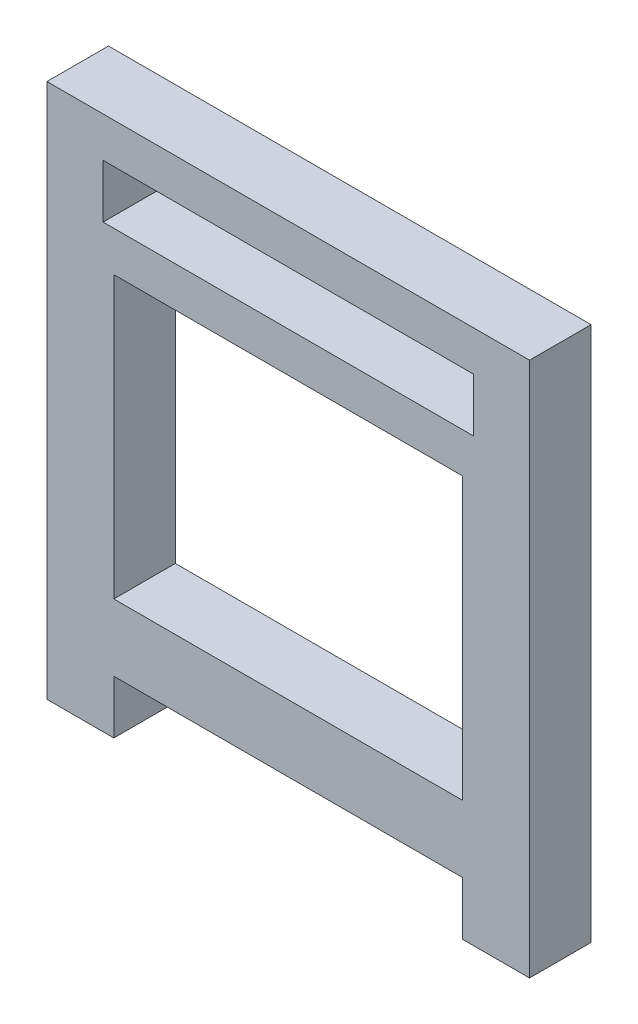
ISO-10303-21;
HEADER;
FILE_DESCRIPTION(('STEP AP214'),'2;1');
FILE_NAME('part.step','',(''),(''),'','','');
FILE_SCHEMA(('AUTOMOTIVE_DESIGN { 1 0 10303 214 1 1 1 1 }'));
ENDSEC;
DATA;
#1=APPLICATION_CONTEXT('core data for automotive mechanical design processes');
#2=APPLICATION_PROTOCOL_DEFINITION('international standard','automotive_design',2000,#1);
#3=PRODUCT_CONTEXT('',#1,'mechanical');
#4=PRODUCT('Part','Part','',(#3));
#5=PRODUCT_RELATED_PRODUCT_CATEGORY('part','',(#4));
#6=PRODUCT_DEFINITION_FORMATION('','',#4);
#7=PRODUCT_DEFINITION_CONTEXT('part definition',#1,'design');
#8=PRODUCT_DEFINITION('design','',#6,#7);
#9=PRODUCT_DEFINITION_SHAPE('','',#8);
#10=(LENGTH_UNIT() NAMED_UNIT(*) SI_UNIT(.MILLI.,.METRE.));
#11=(NAMED_UNIT(*) PLANE_ANGLE_UNIT() SI_UNIT($,.RADIAN.));
#12=(NAMED_UNIT(*) SI_UNIT($,.STERADIAN.) SOLID_ANGLE_UNIT());
#13=UNCERTAINTY_MEASURE_WITH_UNIT(LENGTH_MEASURE(1.E-05),#10,'distance_accuracy_value','');
#14=(GEOMETRIC_REPRESENTATION_CONTEXT(3) GLOBAL_UNCERTAINTY_ASSIGNED_CONTEXT((#13)) GLOBAL_UNIT_ASSIGNED_CONTEXT((#10,
#11,#12)) REPRESENTATION_CONTEXT('',''));
#15=CARTESIAN_POINT('',(0.,0.,0.));
#16=DIRECTION('',(0.,0.,1.));
#17=DIRECTION('',(1.,0.,0.));
#18=AXIS2_PLACEMENT_3D('',#15,#16,#17);
#19=CARTESIAN_POINT('',(0.,0.,2.3));
#20=DIRECTION('',(0.,0.,-1.));
#21=DIRECTION('',(-1.,0.,0.));
#22=AXIS2_PLACEMENT_3D('',#19,#20,#21);
#23=PLANE('',#22);
#24=DIRECTION('',(0.,1.,0.));
#25=VECTOR('',#24,1.);
#26=CARTESIAN_POINT('',(15.54,2.5,2.3));
#27=LINE('',#26,#25);
#28=CARTESIAN_POINT('',(15.54,2.5,2.3));
#29=VERTEX_POINT('',#28);
#30=CARTESIAN_POINT('',(15.54,13.,2.3));
#31=VERTEX_POINT('',#30);
#32=EDGE_CURVE('E188',#29,#31,#27,.T.);
#33=ORIENTED_EDGE('',*,*,#32,.F.);
#34=DIRECTION('',(1.,0.,0.));
#35=VECTOR('',#34,1.);
#36=CARTESIAN_POINT('',(2.5,2.5,2.3));
#37=LINE('',#36,#35);
#38=CARTESIAN_POINT('',(2.5,2.5,2.3));
#39=VERTEX_POINT('',#38);
#40=EDGE_CURVE('E196',#39,#29,#37,.T.);
#41=ORIENTED_EDGE('',*,*,#40,.F.);
#42=DIRECTION('',(0.,-1.,0.));
#43=VECTOR('',#42,1.);
#44=CARTESIAN_POINT('',(2.5,2.5,2.3));
#45=LINE('',#44,#43);
#46=CARTESIAN_POINT('',(2.5,13.,2.3));
#47=VERTEX_POINT('',#46);
#48=EDGE_CURVE('E193',#47,#39,#45,.T.);
#49=ORIENTED_EDGE('',*,*,#48,.F.);
#50=DIRECTION('',(-1.,0.,0.));
#51=VECTOR('',#50,1.);
#52=CARTESIAN_POINT('',(2.5,13.,2.3));
#53=LINE('',#52,#51);
#54=EDGE_CURVE('E190',#31,#47,#53,.T.);
#55=ORIENTED_EDGE('',*,*,#54,.F.);
#56=EDGE_LOOP('',(#33,#41,#49,#55));
#57=FACE_BOUND('',#56,.T.);
#58=DIRECTION('',(0.,-1.,0.));
#59=VECTOR('',#58,1.);
#60=CARTESIAN_POINT('',(0.,0.,2.3));
#61=LINE('',#60,#59);
#62=CARTESIAN_POINT('',(0.,18.,2.3));
#63=VERTEX_POINT('',#62);
#64=CARTESIAN_POINT('',(0.,-2.,2.3));
#65=VERTEX_POINT('',#64);
#66=EDGE_CURVE('E219',#63,#65,#61,.T.);
#67=ORIENTED_EDGE('',*,*,#66,.T.);
#68=DIRECTION('',(1.,0.,0.));
#69=VECTOR('',#68,1.);
#70=CARTESIAN_POINT('',(0.,-2.,2.3));
#71=LINE('',#70,#69);
#72=CARTESIAN_POINT('',(2.5,-2.,2.3));
#73=VERTEX_POINT('',#72);
#74=EDGE_CURVE('E221',#65,#73,#71,.T.);
#75=ORIENTED_EDGE('',*,*,#74,.T.);
#76=DIRECTION('',(0.,1.,0.));
#77=VECTOR('',#76,1.);
#78=CARTESIAN_POINT('',(2.5,-2.,2.3));
#79=LINE('',#78,#77);
#80=CARTESIAN_POINT('',(2.5,0.,2.3));
#81=VERTEX_POINT('',#80);
#82=EDGE_CURVE('E224',#73,#81,#79,.T.);
#83=ORIENTED_EDGE('',*,*,#82,.T.);
#84=DIRECTION('',(1.,0.,0.));
#85=VECTOR('',#84,1.);
#86=CARTESIAN_POINT('',(2.5,0.,2.3));
#87=LINE('',#86,#85);
#88=CARTESIAN_POINT('',(15.54,0.,2.3));
#89=VERTEX_POINT('',#88);
#90=EDGE_CURVE('E226',#81,#89,#87,.T.);
#91=ORIENTED_EDGE('',*,*,#90,.T.);
#92=DIRECTION('',(0.,-1.,0.));
#93=VECTOR('',#92,1.);
#94=CARTESIAN_POINT('',(15.54,-2.,2.3));
#95=LINE('',#94,#93);
#96=CARTESIAN_POINT('',(15.54,-2.,2.3));
#97=VERTEX_POINT('',#96);
#98=EDGE_CURVE('E228',#89,#97,#95,.T.);
#99=ORIENTED_EDGE('',*,*,#98,.T.);
#100=DIRECTION('',(1.,0.,0.));
#101=VECTOR('',#100,1.);
#102=CARTESIAN_POINT('',(18.04,-2.,2.3));
#103=LINE('',#102,#101);
#104=CARTESIAN_POINT('',(18.04,-2.,2.3));
#105=VERTEX_POINT('',#104);
#106=EDGE_CURVE('E230',#97,#105,#103,.T.);
#107=ORIENTED_EDGE('',*,*,#106,.T.);
#108=DIRECTION('',(0.,1.,0.));
#109=VECTOR('',#108,1.);
#110=CARTESIAN_POINT('',(18.04,0.,2.3));
#111=LINE('',#110,#109);
#112=CARTESIAN_POINT('',(18.04,18.,2.3));
#113=VERTEX_POINT('',#112);
#114=EDGE_CURVE('E232',#105,#113,#111,.T.);
#115=ORIENTED_EDGE('',*,*,#114,.T.);
#116=DIRECTION('',(-1.,0.,0.));
#117=VECTOR('',#116,1.);
#118=CARTESIAN_POINT('',(0.,18.,2.3));
#119=LINE('',#118,#117);
#120=EDGE_CURVE('E234',#113,#63,#119,.T.);
#121=ORIENTED_EDGE('',*,*,#120,.T.);
#122=EDGE_LOOP('',(#67,#75,#83,#91,#99,#107,#115,#121));
#123=FACE_BOUND('',#122,.T.);
#124=DIRECTION('',(0.,-1.,0.));
#125=VECTOR('',#124,1.);
#126=CARTESIAN_POINT('',(2.1,14.5,2.3));
#127=LINE('',#126,#125);
#128=CARTESIAN_POINT('',(2.1,16.5,2.3));
#129=VERTEX_POINT('',#128);
#130=CARTESIAN_POINT('',(2.1,14.5,2.3));
#131=VERTEX_POINT('',#130);
#132=EDGE_CURVE('E152',#129,#131,#127,.T.);
#133=ORIENTED_EDGE('',*,*,#132,.F.);
#134=DIRECTION('',(-1.,0.,0.));
#135=VECTOR('',#134,1.);
#136=CARTESIAN_POINT('',(2.1,16.5,2.3));
#137=LINE('',#136,#135);
#138=CARTESIAN_POINT('',(15.94,16.5,2.3));
#139=VERTEX_POINT('',#138);
#140=EDGE_CURVE('E174',#139,#129,#137,.T.);
#141=ORIENTED_EDGE('',*,*,#140,.F.);
#142=DIRECTION('',(0.,1.,0.));
#143=VECTOR('',#142,1.);
#144=CARTESIAN_POINT('',(15.94,14.5,2.3));
#145=LINE('',#144,#143);
#146=CARTESIAN_POINT('',(15.94,14.5,2.3));
#147=VERTEX_POINT('',#146);
#148=EDGE_CURVE('E172',#147,#139,#145,.T.);
#149=ORIENTED_EDGE('',*,*,#148,.F.);
#150=DIRECTION('',(1.,0.,0.));
#151=VECTOR('',#150,1.);
#152=CARTESIAN_POINT('',(2.1,14.5,2.3));
#153=LINE('',#152,#151);
#154=EDGE_CURVE('E160',#131,#147,#153,.T.);
#155=ORIENTED_EDGE('',*,*,#154,.F.);
#156=EDGE_LOOP('',(#133,#141,#149,#155));
#157=FACE_BOUND('',#156,.T.);
#158=ADVANCED_FACE('F39',(#57,#123,#157),#23,.F.);
#159=CARTESIAN_POINT('',(0.,0.,0.));
#160=DIRECTION('',(0.,0.,-1.));
#161=DIRECTION('',(-1.,0.,0.));
#162=AXIS2_PLACEMENT_3D('',#159,#160,#161);
#163=PLANE('',#162);
#164=DIRECTION('',(0.,-1.,0.));
#165=VECTOR('',#164,1.);
#166=CARTESIAN_POINT('',(0.,0.,0.));
#167=LINE('',#166,#165);
#168=CARTESIAN_POINT('',(0.,18.,0.));
#169=VERTEX_POINT('',#168);
#170=CARTESIAN_POINT('',(0.,-2.,0.));
#171=VERTEX_POINT('',#170);
#172=EDGE_CURVE('E218',#169,#171,#167,.T.);
#173=ORIENTED_EDGE('',*,*,#172,.F.);
#174=DIRECTION('',(-1.,0.,0.));
#175=VECTOR('',#174,1.);
#176=CARTESIAN_POINT('',(0.,18.,0.));
#177=LINE('',#176,#175);
#178=CARTESIAN_POINT('',(18.04,18.,0.));
#179=VERTEX_POINT('',#178);
#180=EDGE_CURVE('E222',#179,#169,#177,.T.);
#181=ORIENTED_EDGE('',*,*,#180,.F.);
#182=DIRECTION('',(0.,1.,0.));
#183=VECTOR('',#182,1.);
#184=CARTESIAN_POINT('',(18.04,0.,0.));
#185=LINE('',#184,#183);
#186=CARTESIAN_POINT('',(18.04,-2.,0.));
#187=VERTEX_POINT('',#186);
#188=EDGE_CURVE('E249',#187,#179,#185,.T.);
#189=ORIENTED_EDGE('',*,*,#188,.F.);
#190=DIRECTION('',(1.,0.,0.));
#191=VECTOR('',#190,1.);
#192=CARTESIAN_POINT('',(18.04,-2.,0.));
#193=LINE('',#192,#191);
#194=CARTESIAN_POINT('',(15.54,-2.,0.));
#195=VERTEX_POINT('',#194);
#196=EDGE_CURVE('E246',#195,#187,#193,.T.);
#197=ORIENTED_EDGE('',*,*,#196,.F.);
#198=DIRECTION('',(0.,-1.,0.));
#199=VECTOR('',#198,1.);
#200=CARTESIAN_POINT('',(15.54,-2.,0.));
#201=LINE('',#200,#199);
#202=CARTESIAN_POINT('',(15.54,0.,0.));
#203=VERTEX_POINT('',#202);
#204=EDGE_CURVE('E244',#203,#195,#201,.T.);
#205=ORIENTED_EDGE('',*,*,#204,.F.);
#206=DIRECTION('',(1.,0.,0.));
#207=VECTOR('',#206,1.);
#208=CARTESIAN_POINT('',(2.5,0.,0.));
#209=LINE('',#208,#207);
#210=CARTESIAN_POINT('',(2.5,0.,0.));
#211=VERTEX_POINT('',#210);
#212=EDGE_CURVE('E242',#211,#203,#209,.T.);
#213=ORIENTED_EDGE('',*,*,#212,.F.);
#214=DIRECTION('',(0.,1.,0.));
#215=VECTOR('',#214,1.);
#216=CARTESIAN_POINT('',(2.5,-2.,0.));
#217=LINE('',#216,#215);
#218=CARTESIAN_POINT('',(2.5,-2.,0.));
#219=VERTEX_POINT('',#218);
#220=EDGE_CURVE('E240',#219,#211,#217,.T.);
#221=ORIENTED_EDGE('',*,*,#220,.F.);
#222=DIRECTION('',(1.,0.,0.));
#223=VECTOR('',#222,1.);
#224=CARTESIAN_POINT('',(0.,-2.,0.));
#225=LINE('',#224,#223);
#226=EDGE_CURVE('E238',#171,#219,#225,.T.);
#227=ORIENTED_EDGE('',*,*,#226,.F.);
#228=EDGE_LOOP('',(#173,#181,#189,#197,#205,#213,#221,#227));
#229=FACE_BOUND('',#228,.T.);
#230=DIRECTION('',(1.,0.,0.));
#231=VECTOR('',#230,1.);
#232=CARTESIAN_POINT('',(2.5,2.5,0.));
#233=LINE('',#232,#231);
#234=CARTESIAN_POINT('',(2.5,2.5,0.));
#235=VERTEX_POINT('',#234);
#236=CARTESIAN_POINT('',(15.54,2.5,0.));
#237=VERTEX_POINT('',#236);
#238=EDGE_CURVE('E191',#235,#237,#233,.T.);
#239=ORIENTED_EDGE('',*,*,#238,.T.);
#240=DIRECTION('',(0.,1.,0.));
#241=VECTOR('',#240,1.);
#242=CARTESIAN_POINT('',(15.54,2.5,0.));
#243=LINE('',#242,#241);
#244=CARTESIAN_POINT('',(15.54,13.,0.));
#245=VERTEX_POINT('',#244);
#246=EDGE_CURVE('E168',#237,#245,#243,.T.);
#247=ORIENTED_EDGE('',*,*,#246,.T.);
#248=DIRECTION('',(-1.,0.,0.));
#249=VECTOR('',#248,1.);
#250=CARTESIAN_POINT('',(2.5,13.,0.));
#251=LINE('',#250,#249);
#252=CARTESIAN_POINT('',(2.5,13.,0.));
#253=VERTEX_POINT('',#252);
#254=EDGE_CURVE('E201',#245,#253,#251,.T.);
#255=ORIENTED_EDGE('',*,*,#254,.T.);
#256=DIRECTION('',(0.,-1.,0.));
#257=VECTOR('',#256,1.);
#258=CARTESIAN_POINT('',(2.5,2.5,0.));
#259=LINE('',#258,#257);
#260=EDGE_CURVE('E204',#253,#235,#259,.T.);
#261=ORIENTED_EDGE('',*,*,#260,.T.);
#262=EDGE_LOOP('',(#239,#247,#255,#261));
#263=FACE_BOUND('',#262,.T.);
#264=DIRECTION('',(-1.,0.,0.));
#265=VECTOR('',#264,1.);
#266=CARTESIAN_POINT('',(2.1,16.5,0.));
#267=LINE('',#266,#265);
#268=CARTESIAN_POINT('',(15.94,16.5,0.));
#269=VERTEX_POINT('',#268);
#270=CARTESIAN_POINT('',(2.1,16.5,0.));
#271=VERTEX_POINT('',#270);
#272=EDGE_CURVE('E161',#269,#271,#267,.T.);
#273=ORIENTED_EDGE('',*,*,#272,.T.);
#274=DIRECTION('',(0.,-1.,0.));
#275=VECTOR('',#274,1.);
#276=CARTESIAN_POINT('',(2.1,14.5,0.));
#277=LINE('',#276,#275);
#278=CARTESIAN_POINT('',(2.1,14.5,0.));
#279=VERTEX_POINT('',#278);
#280=EDGE_CURVE('E62',#271,#279,#277,.T.);
#281=ORIENTED_EDGE('',*,*,#280,.T.);
#282=DIRECTION('',(1.,0.,0.));
#283=VECTOR('',#282,1.);
#284=CARTESIAN_POINT('',(2.1,14.5,0.));
#285=LINE('',#284,#283);
#286=CARTESIAN_POINT('',(15.94,14.5,0.));
#287=VERTEX_POINT('',#286);
#288=EDGE_CURVE('E167',#279,#287,#285,.T.);
#289=ORIENTED_EDGE('',*,*,#288,.T.);
#290=DIRECTION('',(0.,1.,0.));
#291=VECTOR('',#290,1.);
#292=CARTESIAN_POINT('',(15.94,14.5,0.));
#293=LINE('',#292,#291);
#294=EDGE_CURVE('E180',#287,#269,#293,.T.);
#295=ORIENTED_EDGE('',*,*,#294,.T.);
#296=EDGE_LOOP('',(#273,#281,#289,#295));
#297=FACE_BOUND('',#296,.T.);
#298=ADVANCED_FACE('F281',(#229,#263,#297),#163,.T.);
#299=CARTESIAN_POINT('',(0.,0.,2.3));
#300=DIRECTION('',(1.,0.,0.));
#301=DIRECTION('',(0.,1.,0.));
#302=AXIS2_PLACEMENT_3D('',#299,#300,#301);
#303=PLANE('',#302);
#304=ORIENTED_EDGE('',*,*,#172,.T.);
#305=DIRECTION('',(0.,0.,-1.));
#306=VECTOR('',#305,1.);
#307=CARTESIAN_POINT('',(0.,-2.,2.3));
#308=LINE('',#307,#306);
#309=EDGE_CURVE('E11',#65,#171,#308,.T.);
#310=ORIENTED_EDGE('',*,*,#309,.F.);
#311=ORIENTED_EDGE('',*,*,#66,.F.);
#312=DIRECTION('',(0.,0.,-1.));
#313=VECTOR('',#312,1.);
#314=CARTESIAN_POINT('',(0.,18.,2.3));
#315=LINE('',#314,#313);
#316=EDGE_CURVE('E236',#63,#169,#315,.T.);
#317=ORIENTED_EDGE('',*,*,#316,.T.);
#318=EDGE_LOOP('',(#304,#310,#311,#317));
#319=FACE_BOUND('',#318,.T.);
#320=ADVANCED_FACE('F41',(#319),#303,.F.);
#321=CARTESIAN_POINT('',(0.,-2.,2.3));
#322=DIRECTION('',(0.,1.,0.));
#323=DIRECTION('',(0.,0.,1.));
#324=AXIS2_PLACEMENT_3D('',#321,#322,#323);
#325=PLANE('',#324);
#326=ORIENTED_EDGE('',*,*,#226,.T.);
#327=DIRECTION('',(0.,0.,-1.));
#328=VECTOR('',#327,1.);
#329=CARTESIAN_POINT('',(2.5,-2.,2.3));
#330=LINE('',#329,#328);
#331=EDGE_CURVE('E47',#73,#219,#330,.T.);
#332=ORIENTED_EDGE('',*,*,#331,.F.);
#333=ORIENTED_EDGE('',*,*,#74,.F.);
#334=ORIENTED_EDGE('',*,*,#309,.T.);
#335=EDGE_LOOP('',(#326,#332,#333,#334));
#336=FACE_BOUND('',#335,.T.);
#337=ADVANCED_FACE('F298',(#336),#325,.F.);
#338=CARTESIAN_POINT('',(2.5,-2.,2.3));
#339=DIRECTION('',(-1.,0.,0.));
#340=DIRECTION('',(0.,0.,1.));
#341=AXIS2_PLACEMENT_3D('',#338,#339,#340);
#342=PLANE('',#341);
#343=ORIENTED_EDGE('',*,*,#220,.T.);
#344=DIRECTION('',(0.,0.,-1.));
#345=VECTOR('',#344,1.);
#346=CARTESIAN_POINT('',(2.5,0.,2.3));
#347=LINE('',#346,#345);
#348=EDGE_CURVE('E267',#81,#211,#347,.T.);
#349=ORIENTED_EDGE('',*,*,#348,.F.);
#350=ORIENTED_EDGE('',*,*,#82,.F.);
#351=ORIENTED_EDGE('',*,*,#331,.T.);
#352=EDGE_LOOP('',(#343,#349,#350,#351));
#353=FACE_BOUND('',#352,.T.);
#354=ADVANCED_FACE('F274',(#353),#342,.F.);
#355=CARTESIAN_POINT('',(2.5,0.,2.3));
#356=DIRECTION('',(0.,1.,0.));
#357=DIRECTION('',(0.,0.,1.));
#358=AXIS2_PLACEMENT_3D('',#355,#356,#357);
#359=PLANE('',#358);
#360=ORIENTED_EDGE('',*,*,#212,.T.);
#361=DIRECTION('',(0.,0.,-1.));
#362=VECTOR('',#361,1.);
#363=CARTESIAN_POINT('',(15.54,0.,2.3));
#364=LINE('',#363,#362);
#365=EDGE_CURVE('E264',#89,#203,#364,.T.);
#366=ORIENTED_EDGE('',*,*,#365,.F.);
#367=ORIENTED_EDGE('',*,*,#90,.F.);
#368=ORIENTED_EDGE('',*,*,#348,.T.);
#369=EDGE_LOOP('',(#360,#366,#367,#368));
#370=FACE_BOUND('',#369,.T.);
#371=ADVANCED_FACE('F287',(#370),#359,.F.);
#372=CARTESIAN_POINT('',(15.54,-2.,2.3));
#373=DIRECTION('',(1.,0.,0.));
#374=DIRECTION('',(0.,0.,-1.));
#375=AXIS2_PLACEMENT_3D('',#372,#373,#374);
#376=PLANE('',#375);
#377=ORIENTED_EDGE('',*,*,#204,.T.);
#378=DIRECTION('',(0.,0.,-1.));
#379=VECTOR('',#378,1.);
#380=CARTESIAN_POINT('',(15.54,-2.,2.3));
#381=LINE('',#380,#379);
#382=EDGE_CURVE('E261',#97,#195,#381,.T.);
#383=ORIENTED_EDGE('',*,*,#382,.F.);
#384=ORIENTED_EDGE('',*,*,#98,.F.);
#385=ORIENTED_EDGE('',*,*,#365,.T.);
#386=EDGE_LOOP('',(#377,#383,#384,#385));
#387=FACE_BOUND('',#386,.T.);
#388=ADVANCED_FACE('F291',(#387),#376,.F.);
#389=CARTESIAN_POINT('',(18.04,-2.,2.3));
#390=DIRECTION('',(0.,1.,0.));
#391=DIRECTION('',(-1.,0.,0.));
#392=AXIS2_PLACEMENT_3D('',#389,#390,#391);
#393=PLANE('',#392);
#394=ORIENTED_EDGE('',*,*,#196,.T.);
#395=DIRECTION('',(0.,0.,-1.));
#396=VECTOR('',#395,1.);
#397=CARTESIAN_POINT('',(18.04,-2.,2.3));
#398=LINE('',#397,#396);
#399=EDGE_CURVE('E258',#105,#187,#398,.T.);
#400=ORIENTED_EDGE('',*,*,#399,.F.);
#401=ORIENTED_EDGE('',*,*,#106,.F.);
#402=ORIENTED_EDGE('',*,*,#382,.T.);
#403=EDGE_LOOP('',(#394,#400,#401,#402));
#404=FACE_BOUND('',#403,.T.);
#405=ADVANCED_FACE('F310',(#404),#393,.F.);
#406=CARTESIAN_POINT('',(18.04,0.,2.3));
#407=DIRECTION('',(-1.,0.,0.));
#408=DIRECTION('',(0.,0.,1.));
#409=AXIS2_PLACEMENT_3D('',#406,#407,#408);
#410=PLANE('',#409);
#411=ORIENTED_EDGE('',*,*,#188,.T.);
#412=DIRECTION('',(0.,0.,-1.));
#413=VECTOR('',#412,1.);
#414=CARTESIAN_POINT('',(18.04,18.,2.3));
#415=LINE('',#414,#413);
#416=EDGE_CURVE('E255',#113,#179,#415,.T.);
#417=ORIENTED_EDGE('',*,*,#416,.F.);
#418=ORIENTED_EDGE('',*,*,#114,.F.);
#419=ORIENTED_EDGE('',*,*,#399,.T.);
#420=EDGE_LOOP('',(#411,#417,#418,#419));
#421=FACE_BOUND('',#420,.T.);
#422=ADVANCED_FACE('F308',(#421),#410,.F.);
#423=CARTESIAN_POINT('',(0.,18.,2.3));
#424=DIRECTION('',(0.,-1.,0.));
#425=DIRECTION('',(0.,0.,-1.));
#426=AXIS2_PLACEMENT_3D('',#423,#424,#425);
#427=PLANE('',#426);
#428=ORIENTED_EDGE('',*,*,#180,.T.);
#429=ORIENTED_EDGE('',*,*,#316,.F.);
#430=ORIENTED_EDGE('',*,*,#120,.F.);
#431=ORIENTED_EDGE('',*,*,#416,.T.);
#432=EDGE_LOOP('',(#428,#429,#430,#431));
#433=FACE_BOUND('',#432,.T.);
#434=ADVANCED_FACE('F303',(#433),#427,.F.);
#435=CARTESIAN_POINT('',(15.54,2.5,2.3));
#436=DIRECTION('',(-1.,0.,0.));
#437=DIRECTION('',(0.,0.,1.));
#438=AXIS2_PLACEMENT_3D('',#435,#436,#437);
#439=PLANE('',#438);
#440=ORIENTED_EDGE('',*,*,#246,.F.);
#441=DIRECTION('',(0.,0.,-1.));
#442=VECTOR('',#441,1.);
#443=CARTESIAN_POINT('',(15.54,2.5,2.3));
#444=LINE('',#443,#442);
#445=EDGE_CURVE('E198',#29,#237,#444,.T.);
#446=ORIENTED_EDGE('',*,*,#445,.F.);
#447=ORIENTED_EDGE('',*,*,#32,.T.);
#448=DIRECTION('',(0.,0.,-1.));
#449=VECTOR('',#448,1.);
#450=CARTESIAN_POINT('',(15.54,13.,2.3));
#451=LINE('',#450,#449);
#452=EDGE_CURVE('E215',#31,#245,#451,.T.);
#453=ORIENTED_EDGE('',*,*,#452,.T.);
#454=EDGE_LOOP('',(#440,#446,#447,#453));
#455=FACE_BOUND('',#454,.T.);
#456=ADVANCED_FACE('F328',(#455),#439,.T.);
#457=CARTESIAN_POINT('',(2.5,13.,2.3));
#458=DIRECTION('',(0.,-1.,0.));
#459=DIRECTION('',(0.,0.,-1.));
#460=AXIS2_PLACEMENT_3D('',#457,#458,#459);
#461=PLANE('',#460);
#462=ORIENTED_EDGE('',*,*,#254,.F.);
#463=ORIENTED_EDGE('',*,*,#452,.F.);
#464=ORIENTED_EDGE('',*,*,#54,.T.);
#465=DIRECTION('',(0.,0.,-1.));
#466=VECTOR('',#465,1.);
#467=CARTESIAN_POINT('',(2.5,13.,2.3));
#468=LINE('',#467,#466);
#469=EDGE_CURVE('E213',#47,#253,#468,.T.);
#470=ORIENTED_EDGE('',*,*,#469,.T.);
#471=EDGE_LOOP('',(#462,#463,#464,#470));
#472=FACE_BOUND('',#471,.T.);
#473=ADVANCED_FACE('F335',(#472),#461,.T.);
#474=CARTESIAN_POINT('',(2.5,2.5,2.3));
#475=DIRECTION('',(1.,0.,0.));
#476=DIRECTION('',(0.,0.,-1.));
#477=AXIS2_PLACEMENT_3D('',#474,#475,#476);
#478=PLANE('',#477);
#479=ORIENTED_EDGE('',*,*,#260,.F.);
#480=ORIENTED_EDGE('',*,*,#469,.F.);
#481=ORIENTED_EDGE('',*,*,#48,.T.);
#482=DIRECTION('',(0.,0.,-1.));
#483=VECTOR('',#482,1.);
#484=CARTESIAN_POINT('',(2.5,2.5,2.3));
#485=LINE('',#484,#483);
#486=EDGE_CURVE('E211',#39,#235,#485,.T.);
#487=ORIENTED_EDGE('',*,*,#486,.T.);
#488=EDGE_LOOP('',(#479,#480,#481,#487));
#489=FACE_BOUND('',#488,.T.);
#490=ADVANCED_FACE('F340',(#489),#478,.T.);
#491=CARTESIAN_POINT('',(2.5,2.5,2.3));
#492=DIRECTION('',(0.,1.,0.));
#493=DIRECTION('',(0.,0.,1.));
#494=AXIS2_PLACEMENT_3D('',#491,#492,#493);
#495=PLANE('',#494);
#496=ORIENTED_EDGE('',*,*,#238,.F.);
#497=ORIENTED_EDGE('',*,*,#486,.F.);
#498=ORIENTED_EDGE('',*,*,#40,.T.);
#499=ORIENTED_EDGE('',*,*,#445,.T.);
#500=EDGE_LOOP('',(#496,#497,#498,#499));
#501=FACE_BOUND('',#500,.T.);
#502=ADVANCED_FACE('F346',(#501),#495,.T.);
#503=CARTESIAN_POINT('',(2.1,14.5,2.3));
#504=DIRECTION('',(1.,0.,0.));
#505=DIRECTION('',(0.,0.,-1.));
#506=AXIS2_PLACEMENT_3D('',#503,#504,#505);
#507=PLANE('',#506);
#508=ORIENTED_EDGE('',*,*,#280,.F.);
#509=DIRECTION('',(0.,0.,-1.));
#510=VECTOR('',#509,1.);
#511=CARTESIAN_POINT('',(2.1,16.5,2.3));
#512=LINE('',#511,#510);
#513=EDGE_CURVE('E156',#129,#271,#512,.T.);
#514=ORIENTED_EDGE('',*,*,#513,.F.);
#515=ORIENTED_EDGE('',*,*,#132,.T.);
#516=DIRECTION('',(0.,0.,-1.));
#517=VECTOR('',#516,1.);
#518=CARTESIAN_POINT('',(2.1,14.5,2.3));
#519=LINE('',#518,#517);
#520=EDGE_CURVE('E155',#131,#279,#519,.T.);
#521=ORIENTED_EDGE('',*,*,#520,.T.);
#522=EDGE_LOOP('',(#508,#514,#515,#521));
#523=FACE_BOUND('',#522,.T.);
#524=ADVANCED_FACE('F154',(#523),#507,.T.);
#525=CARTESIAN_POINT('',(2.1,14.5,2.3));
#526=DIRECTION('',(0.,1.,0.));
#527=DIRECTION('',(0.,0.,1.));
#528=AXIS2_PLACEMENT_3D('',#525,#526,#527);
#529=PLANE('',#528);
#530=ORIENTED_EDGE('',*,*,#288,.F.);
#531=ORIENTED_EDGE('',*,*,#520,.F.);
#532=ORIENTED_EDGE('',*,*,#154,.T.);
#533=DIRECTION('',(0.,0.,-1.));
#534=VECTOR('',#533,1.);
#535=CARTESIAN_POINT('',(15.94,14.5,2.3));
#536=LINE('',#535,#534);
#537=EDGE_CURVE('E169',#147,#287,#536,.T.);
#538=ORIENTED_EDGE('',*,*,#537,.T.);
#539=EDGE_LOOP('',(#530,#531,#532,#538));
#540=FACE_BOUND('',#539,.T.);
#541=ADVANCED_FACE('F164',(#540),#529,.T.);
#542=CARTESIAN_POINT('',(15.94,14.5,2.3));
#543=DIRECTION('',(-1.,0.,0.));
#544=DIRECTION('',(0.,0.,1.));
#545=AXIS2_PLACEMENT_3D('',#542,#543,#544);
#546=PLANE('',#545);
#547=ORIENTED_EDGE('',*,*,#294,.F.);
#548=ORIENTED_EDGE('',*,*,#537,.F.);
#549=ORIENTED_EDGE('',*,*,#148,.T.);
#550=DIRECTION('',(0.,0.,-1.));
#551=VECTOR('',#550,1.);
#552=CARTESIAN_POINT('',(15.94,16.5,2.3));
#553=LINE('',#552,#551);
#554=EDGE_CURVE('E54',#139,#269,#553,.T.);
#555=ORIENTED_EDGE('',*,*,#554,.T.);
#556=EDGE_LOOP('',(#547,#548,#549,#555));
#557=FACE_BOUND('',#556,.T.);
#558=ADVANCED_FACE('F365',(#557),#546,.T.);
#559=CARTESIAN_POINT('',(2.1,16.5,2.3));
#560=DIRECTION('',(0.,-1.,0.));
#561=DIRECTION('',(0.,0.,-1.));
#562=AXIS2_PLACEMENT_3D('',#559,#560,#561);
#563=PLANE('',#562);
#564=ORIENTED_EDGE('',*,*,#272,.F.);
#565=ORIENTED_EDGE('',*,*,#554,.F.);
#566=ORIENTED_EDGE('',*,*,#140,.T.);
#567=ORIENTED_EDGE('',*,*,#513,.T.);
#568=EDGE_LOOP('',(#564,#565,#566,#567));
#569=FACE_BOUND('',#568,.T.);
#570=ADVANCED_FACE('F368',(#569),#563,.T.);
#571=CLOSED_SHELL('',(#158,#298,#320,#337,#354,#371,#388,#405,#422,#434,#456,#473,#490,#502,
#524,#541,#558,#570));
#572=MANIFOLD_SOLID_BREP('B2',#571);
#573=ADVANCED_BREP_SHAPE_REPRESENTATION('',(#18,#572),#14);
#574=SHAPE_DEFINITION_REPRESENTATION(#9,#573);
ENDSEC;
END-ISO-10303-21;
